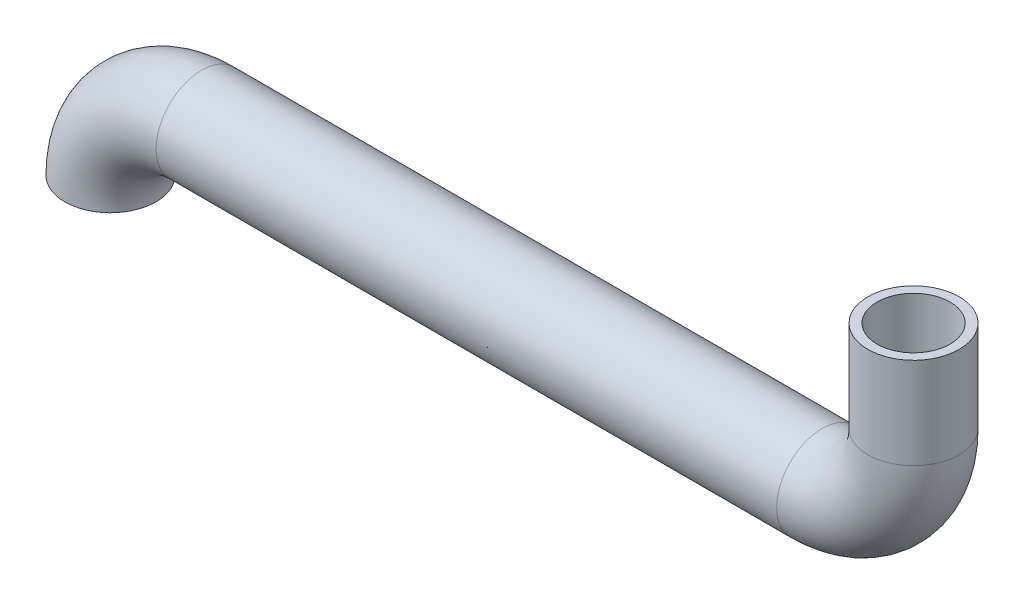
ISO-10303-21;
HEADER;
FILE_DESCRIPTION(('STEP AP214'),'2;1');
FILE_NAME('part.step','',(''),(''),'','','');
FILE_SCHEMA(('AUTOMOTIVE_DESIGN { 1 0 10303 214 1 1 1 1 }'));
ENDSEC;
DATA;
#1=APPLICATION_CONTEXT('core data for automotive mechanical design processes');
#2=APPLICATION_PROTOCOL_DEFINITION('international standard','automotive_design',2000,#1);
#3=PRODUCT_CONTEXT('',#1,'mechanical');
#4=PRODUCT('Part','Part','',(#3));
#5=PRODUCT_RELATED_PRODUCT_CATEGORY('part','',(#4));
#6=PRODUCT_DEFINITION_FORMATION('','',#4);
#7=PRODUCT_DEFINITION_CONTEXT('part definition',#1,'design');
#8=PRODUCT_DEFINITION('design','',#6,#7);
#9=PRODUCT_DEFINITION_SHAPE('','',#8);
#10=(LENGTH_UNIT() NAMED_UNIT(*) SI_UNIT(.MILLI.,.METRE.));
#11=(NAMED_UNIT(*) PLANE_ANGLE_UNIT() SI_UNIT($,.RADIAN.));
#12=(NAMED_UNIT(*) SI_UNIT($,.STERADIAN.) SOLID_ANGLE_UNIT());
#13=UNCERTAINTY_MEASURE_WITH_UNIT(LENGTH_MEASURE(1.E-05),#10,'distance_accuracy_value','');
#14=(GEOMETRIC_REPRESENTATION_CONTEXT(3) GLOBAL_UNCERTAINTY_ASSIGNED_CONTEXT((#13)) GLOBAL_UNIT_ASSIGNED_CONTEXT((#10,
#11,#12)) REPRESENTATION_CONTEXT('',''));
#15=CARTESIAN_POINT('',(0.,0.,0.));
#16=DIRECTION('',(0.,0.,1.));
#17=DIRECTION('',(1.,0.,0.));
#18=AXIS2_PLACEMENT_3D('',#15,#16,#17);
#19=CARTESIAN_POINT('',(-9.99999999999999,0.,0.));
#20=DIRECTION('',(0.,-1.,0.));
#21=DIRECTION('',(0.,0.,-1.));
#22=AXIS2_PLACEMENT_3D('',#19,#20,#21);
#23=PLANE('',#22);
#24=CARTESIAN_POINT('',(-9.99999999999999,0.,0.));
#25=DIRECTION('',(0.,-1.,0.));
#26=DIRECTION('',(0.,0.,-1.));
#27=AXIS2_PLACEMENT_3D('',#24,#25,#26);
#28=CIRCLE('',#27,4.);
#29=CARTESIAN_POINT('',(-14.,0.,0.));
#30=VERTEX_POINT('',#29);
#31=EDGE_CURVE('E76',#30,#30,#28,.T.);
#32=ORIENTED_EDGE('',*,*,#31,.F.);
#33=EDGE_LOOP('',(#32));
#34=FACE_BOUND('',#33,.T.);
#35=CARTESIAN_POINT('',(-9.99999999999999,0.,0.));
#36=DIRECTION('',(0.,-1.,0.));
#37=DIRECTION('',(0.,0.,-1.));
#38=AXIS2_PLACEMENT_3D('',#35,#36,#37);
#39=CIRCLE('',#38,5.);
#40=CARTESIAN_POINT('',(-15.,0.,0.));
#41=VERTEX_POINT('',#40);
#42=EDGE_CURVE('E69',#41,#41,#39,.T.);
#43=ORIENTED_EDGE('',*,*,#42,.T.);
#44=EDGE_LOOP('',(#43));
#45=FACE_BOUND('',#44,.T.);
#46=ADVANCED_FACE('F50',(#34,#45),#23,.T.);
#47=CARTESIAN_POINT('',(78.,30.,0.));
#48=DIRECTION('',(0.,-1.,0.));
#49=DIRECTION('',(0.,0.,-1.));
#50=AXIS2_PLACEMENT_3D('',#47,#48,#49);
#51=PLANE('',#50);
#52=CARTESIAN_POINT('',(78.,30.,0.));
#53=DIRECTION('',(0.,-1.,0.));
#54=DIRECTION('',(0.,0.,-1.));
#55=AXIS2_PLACEMENT_3D('',#52,#53,#54);
#56=CIRCLE('',#55,4.);
#57=CARTESIAN_POINT('',(78.,30.,-4.));
#58=VERTEX_POINT('',#57);
#59=EDGE_CURVE('E72',#58,#58,#56,.T.);
#60=ORIENTED_EDGE('',*,*,#59,.T.);
#61=EDGE_LOOP('',(#60));
#62=FACE_BOUND('',#61,.T.);
#63=CARTESIAN_POINT('',(78.,30.,0.));
#64=DIRECTION('',(0.,-1.,0.));
#65=DIRECTION('',(0.,0.,-1.));
#66=AXIS2_PLACEMENT_3D('',#63,#64,#65);
#67=CIRCLE('',#66,5.);
#68=CARTESIAN_POINT('',(78.,30.,-5.));
#69=VERTEX_POINT('',#68);
#70=EDGE_CURVE('E11',#69,#69,#67,.T.);
#71=ORIENTED_EDGE('',*,*,#70,.F.);
#72=EDGE_LOOP('',(#71));
#73=FACE_BOUND('',#72,.T.);
#74=ADVANCED_FACE('F99',(#62,#73),#51,.F.);
#75=CARTESIAN_POINT('',(0.,0.,0.));
#76=DIRECTION('',(0.,0.,-1.));
#77=DIRECTION('',(-1.,0.,0.));
#78=AXIS2_PLACEMENT_3D('',#75,#76,#77);
#79=TOROIDAL_SURFACE('',#78,9.99999999999999,5.);
#80=CARTESIAN_POINT('',(0.,9.99999999999999,0.));
#81=DIRECTION('',(-1.,0.,0.));
#82=DIRECTION('',(0.,0.,-1.));
#83=AXIS2_PLACEMENT_3D('',#80,#81,#82);
#84=CIRCLE('',#83,5.);
#85=CARTESIAN_POINT('',(0.,15.,0.));
#86=VERTEX_POINT('',#85);
#87=EDGE_CURVE('E64',#86,#86,#84,.T.);
#88=CARTESIAN_POINT('',(0.,0.,0.));
#89=DIRECTION('',(0.,0.,-1.));
#90=DIRECTION('',(-1.,0.,0.));
#91=AXIS2_PLACEMENT_3D('',#88,#89,#90);
#92=CIRCLE('',#91,15.);
#93=EDGE_CURVE('',#41,#86,#92,.T.);
#94=ORIENTED_EDGE('',*,*,#42,.F.);
#95=ORIENTED_EDGE('',*,*,#87,.T.);
#96=ORIENTED_EDGE('',*,*,#93,.T.);
#97=ORIENTED_EDGE('',*,*,#93,.F.);
#98=EDGE_LOOP('',(#94,#96,#95,#97));
#99=FACE_BOUND('',#98,.T.);
#100=ADVANCED_FACE('F103',(#99),#79,.T.);
#101=CARTESIAN_POINT('',(0.,9.99999999999999,0.));
#102=DIRECTION('',(1.,0.,0.));
#103=DIRECTION('',(0.,0.,-1.));
#104=AXIS2_PLACEMENT_3D('',#101,#102,#103);
#105=CYLINDRICAL_SURFACE('',#104,5.);
#106=CARTESIAN_POINT('',(68.,9.99999999999999,0.));
#107=DIRECTION('',(-1.,0.,0.));
#108=DIRECTION('',(0.,0.,-1.));
#109=AXIS2_PLACEMENT_3D('',#106,#107,#108);
#110=CIRCLE('',#109,5.);
#111=CARTESIAN_POINT('',(68.,4.99999999999999,0.));
#112=VERTEX_POINT('',#111);
#113=EDGE_CURVE('E60',#112,#112,#110,.T.);
#114=ORIENTED_EDGE('',*,*,#113,.T.);
#115=EDGE_LOOP('',(#114));
#116=FACE_BOUND('',#115,.T.);
#117=ORIENTED_EDGE('',*,*,#87,.F.);
#118=EDGE_LOOP('',(#117));
#119=FACE_BOUND('',#118,.T.);
#120=ADVANCED_FACE('F105',(#116,#119),#105,.T.);
#121=CARTESIAN_POINT('',(68.,20.,0.));
#122=DIRECTION('',(0.,0.,1.));
#123=DIRECTION('',(1.,0.,0.));
#124=AXIS2_PLACEMENT_3D('',#121,#122,#123);
#125=TOROIDAL_SURFACE('',#124,10.,5.);
#126=CARTESIAN_POINT('',(78.,20.,0.));
#127=DIRECTION('',(0.,-1.,0.));
#128=DIRECTION('',(0.,0.,-1.));
#129=AXIS2_PLACEMENT_3D('',#126,#127,#128);
#130=CIRCLE('',#129,5.);
#131=CARTESIAN_POINT('',(83.,20.,0.));
#132=VERTEX_POINT('',#131);
#133=EDGE_CURVE('E56',#132,#132,#130,.T.);
#134=CARTESIAN_POINT('',(68.,20.,0.));
#135=DIRECTION('',(0.,0.,1.));
#136=DIRECTION('',(1.,0.,0.));
#137=AXIS2_PLACEMENT_3D('',#134,#135,#136);
#138=CIRCLE('',#137,15.);
#139=EDGE_CURVE('',#112,#132,#138,.T.);
#140=ORIENTED_EDGE('',*,*,#113,.F.);
#141=ORIENTED_EDGE('',*,*,#133,.T.);
#142=ORIENTED_EDGE('',*,*,#139,.T.);
#143=ORIENTED_EDGE('',*,*,#139,.F.);
#144=EDGE_LOOP('',(#140,#142,#141,#143));
#145=FACE_BOUND('',#144,.T.);
#146=ADVANCED_FACE('F112',(#145),#125,.T.);
#147=CARTESIAN_POINT('',(78.,20.,0.));
#148=DIRECTION('',(0.,1.,0.));
#149=DIRECTION('',(0.,0.,1.));
#150=AXIS2_PLACEMENT_3D('',#147,#148,#149);
#151=CYLINDRICAL_SURFACE('',#150,5.);
#152=ORIENTED_EDGE('',*,*,#70,.T.);
#153=EDGE_LOOP('',(#152));
#154=FACE_BOUND('',#153,.T.);
#155=ORIENTED_EDGE('',*,*,#133,.F.);
#156=EDGE_LOOP('',(#155));
#157=FACE_BOUND('',#156,.T.);
#158=ADVANCED_FACE('F93',(#154,#157),#151,.T.);
#159=CARTESIAN_POINT('',(0.,0.,0.));
#160=DIRECTION('',(0.,0.,-1.));
#161=DIRECTION('',(-1.,0.,0.));
#162=AXIS2_PLACEMENT_3D('',#159,#160,#161);
#163=TOROIDAL_SURFACE('',#162,9.99999999999999,4.);
#164=CARTESIAN_POINT('',(0.,9.99999999999999,0.));
#165=DIRECTION('',(-1.,0.,0.));
#166=DIRECTION('',(0.,-1.,0.));
#167=AXIS2_PLACEMENT_3D('',#164,#165,#166);
#168=CIRCLE('',#167,4.);
#169=CARTESIAN_POINT('',(0.,14.,0.));
#170=VERTEX_POINT('',#169);
#171=EDGE_CURVE('E79',#170,#170,#168,.T.);
#172=CARTESIAN_POINT('',(0.,0.,0.));
#173=DIRECTION('',(0.,0.,-1.));
#174=DIRECTION('',(-1.,0.,0.));
#175=AXIS2_PLACEMENT_3D('',#172,#173,#174);
#176=CIRCLE('',#175,14.);
#177=EDGE_CURVE('',#30,#170,#176,.T.);
#178=ORIENTED_EDGE('',*,*,#31,.T.);
#179=ORIENTED_EDGE('',*,*,#171,.F.);
#180=ORIENTED_EDGE('',*,*,#177,.T.);
#181=ORIENTED_EDGE('',*,*,#177,.F.);
#182=EDGE_LOOP('',(#178,#180,#179,#181));
#183=FACE_BOUND('',#182,.T.);
#184=ADVANCED_FACE('F90',(#183),#163,.F.);
#185=CARTESIAN_POINT('',(0.,9.99999999999999,0.));
#186=DIRECTION('',(1.,0.,0.));
#187=DIRECTION('',(0.,0.,-1.));
#188=AXIS2_PLACEMENT_3D('',#185,#186,#187);
#189=CYLINDRICAL_SURFACE('',#188,4.);
#190=CARTESIAN_POINT('',(68.,9.99999999999999,0.));
#191=DIRECTION('',(1.,0.,0.));
#192=DIRECTION('',(0.,0.,-1.));
#193=AXIS2_PLACEMENT_3D('',#190,#191,#192);
#194=CIRCLE('',#193,4.);
#195=CARTESIAN_POINT('',(68.,5.99999999999999,0.));
#196=VERTEX_POINT('',#195);
#197=EDGE_CURVE('E82',#196,#196,#194,.F.);
#198=ORIENTED_EDGE('',*,*,#197,.F.);
#199=EDGE_LOOP('',(#198));
#200=FACE_BOUND('',#199,.T.);
#201=ORIENTED_EDGE('',*,*,#171,.T.);
#202=EDGE_LOOP('',(#201));
#203=FACE_BOUND('',#202,.T.);
#204=ADVANCED_FACE('F88',(#200,#203),#189,.F.);
#205=CARTESIAN_POINT('',(68.,20.,0.));
#206=DIRECTION('',(0.,0.,1.));
#207=DIRECTION('',(1.,0.,0.));
#208=AXIS2_PLACEMENT_3D('',#205,#206,#207);
#209=TOROIDAL_SURFACE('',#208,10.,4.);
#210=CARTESIAN_POINT('',(78.,20.,0.));
#211=DIRECTION('',(0.,-1.,0.));
#212=DIRECTION('',(0.,0.,-1.));
#213=AXIS2_PLACEMENT_3D('',#210,#211,#212);
#214=CIRCLE('',#213,4.);
#215=CARTESIAN_POINT('',(82.,20.,0.));
#216=VERTEX_POINT('',#215);
#217=EDGE_CURVE('E75',#216,#216,#214,.T.);
#218=CARTESIAN_POINT('',(68.,20.,0.));
#219=DIRECTION('',(0.,0.,1.));
#220=DIRECTION('',(1.,0.,0.));
#221=AXIS2_PLACEMENT_3D('',#218,#219,#220);
#222=CIRCLE('',#221,14.);
#223=EDGE_CURVE('',#196,#216,#222,.T.);
#224=ORIENTED_EDGE('',*,*,#197,.T.);
#225=ORIENTED_EDGE('',*,*,#217,.F.);
#226=ORIENTED_EDGE('',*,*,#223,.T.);
#227=ORIENTED_EDGE('',*,*,#223,.F.);
#228=EDGE_LOOP('',(#224,#226,#225,#227));
#229=FACE_BOUND('',#228,.T.);
#230=ADVANCED_FACE('F198',(#229),#209,.F.);
#231=CARTESIAN_POINT('',(78.,20.,0.));
#232=DIRECTION('',(0.,1.,0.));
#233=DIRECTION('',(0.,0.,1.));
#234=AXIS2_PLACEMENT_3D('',#231,#232,#233);
#235=CYLINDRICAL_SURFACE('',#234,4.);
#236=ORIENTED_EDGE('',*,*,#59,.F.);
#237=EDGE_LOOP('',(#236));
#238=FACE_BOUND('',#237,.T.);
#239=ORIENTED_EDGE('',*,*,#217,.T.);
#240=EDGE_LOOP('',(#239));
#241=FACE_BOUND('',#240,.T.);
#242=ADVANCED_FACE('F100',(#238,#241),#235,.F.);
#243=CLOSED_SHELL('',(#46,#74,#100,#120,#146,#158,#184,#204,#230,#242));
#244=MANIFOLD_SOLID_BREP('B2',#243);
#245=ADVANCED_BREP_SHAPE_REPRESENTATION('',(#18,#244),#14);
#246=SHAPE_DEFINITION_REPRESENTATION(#9,#245);
ENDSEC;
END-ISO-10303-21;
